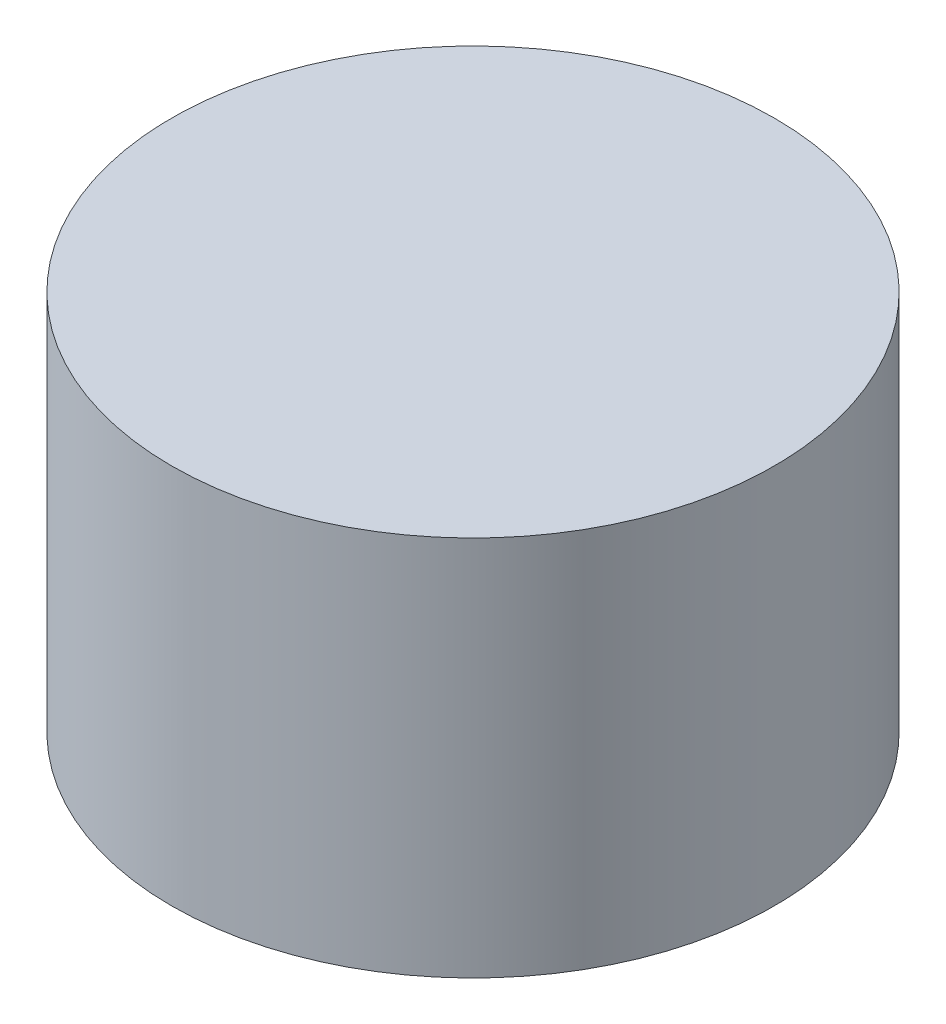
ISO-10303-21;
HEADER;
FILE_DESCRIPTION(('STEP AP214'),'2;1');
FILE_NAME('part.step','',(''),(''),'','','');
FILE_SCHEMA(('AUTOMOTIVE_DESIGN { 1 0 10303 214 1 1 1 1 }'));
ENDSEC;
DATA;
#1=APPLICATION_CONTEXT('core data for automotive mechanical design processes');
#2=APPLICATION_PROTOCOL_DEFINITION('international standard','automotive_design',2000,#1);
#3=PRODUCT_CONTEXT('',#1,'mechanical');
#4=PRODUCT('Part','Part','',(#3));
#5=PRODUCT_RELATED_PRODUCT_CATEGORY('part','',(#4));
#6=PRODUCT_DEFINITION_FORMATION('','',#4);
#7=PRODUCT_DEFINITION_CONTEXT('part definition',#1,'design');
#8=PRODUCT_DEFINITION('design','',#6,#7);
#9=PRODUCT_DEFINITION_SHAPE('','',#8);
#10=(LENGTH_UNIT() NAMED_UNIT(*) SI_UNIT(.MILLI.,.METRE.));
#11=(NAMED_UNIT(*) PLANE_ANGLE_UNIT() SI_UNIT($,.RADIAN.));
#12=(NAMED_UNIT(*) SI_UNIT($,.STERADIAN.) SOLID_ANGLE_UNIT());
#13=UNCERTAINTY_MEASURE_WITH_UNIT(LENGTH_MEASURE(1.E-05),#10,'distance_accuracy_value','');
#14=(GEOMETRIC_REPRESENTATION_CONTEXT(3) GLOBAL_UNCERTAINTY_ASSIGNED_CONTEXT((#13)) GLOBAL_UNIT_ASSIGNED_CONTEXT((#10,
#11,#12)) REPRESENTATION_CONTEXT('',''));
#15=CARTESIAN_POINT('',(0.,0.,0.));
#16=DIRECTION('',(0.,0.,1.));
#17=DIRECTION('',(1.,0.,0.));
#18=AXIS2_PLACEMENT_3D('',#15,#16,#17);
#19=CARTESIAN_POINT('',(0.,141.,0.));
#20=DIRECTION('',(0.,-1.,0.));
#21=DIRECTION('',(0.,0.,-1.));
#22=AXIS2_PLACEMENT_3D('',#19,#20,#21);
#23=CYLINDRICAL_SURFACE('',#22,111.5);
#24=CARTESIAN_POINT('',(0.,141.,0.));
#25=DIRECTION('',(0.,1.,0.));
#26=DIRECTION('',(0.,0.,1.));
#27=AXIS2_PLACEMENT_3D('',#24,#25,#26);
#28=CIRCLE('',#27,111.5);
#29=CARTESIAN_POINT('',(0.,141.,111.5));
#30=VERTEX_POINT('',#29);
#31=EDGE_CURVE('E10',#30,#30,#28,.T.);
#32=ORIENTED_EDGE('',*,*,#31,.F.);
#33=EDGE_LOOP('',(#32));
#34=FACE_BOUND('',#33,.T.);
#35=CARTESIAN_POINT('',(0.,0.,0.));
#36=DIRECTION('',(0.,1.,0.));
#37=DIRECTION('',(0.,0.,1.));
#38=AXIS2_PLACEMENT_3D('',#35,#36,#37);
#39=CIRCLE('',#38,111.5);
#40=CARTESIAN_POINT('',(0.,0.,111.5));
#41=VERTEX_POINT('',#40);
#42=EDGE_CURVE('E40',#41,#41,#39,.T.);
#43=ORIENTED_EDGE('',*,*,#42,.T.);
#44=EDGE_LOOP('',(#43));
#45=FACE_BOUND('',#44,.T.);
#46=ADVANCED_FACE('F37',(#34,#45),#23,.T.);
#47=CARTESIAN_POINT('',(0.,141.,0.));
#48=DIRECTION('',(0.,1.,0.));
#49=DIRECTION('',(0.,0.,1.));
#50=AXIS2_PLACEMENT_3D('',#47,#48,#49);
#51=PLANE('',#50);
#52=ORIENTED_EDGE('',*,*,#31,.T.);
#53=EDGE_LOOP('',(#52));
#54=FACE_BOUND('',#53,.T.);
#55=ADVANCED_FACE('F54',(#54),#51,.T.);
#56=CARTESIAN_POINT('',(0.,0.,0.));
#57=DIRECTION('',(0.,1.,0.));
#58=DIRECTION('',(0.,0.,1.));
#59=AXIS2_PLACEMENT_3D('',#56,#57,#58);
#60=PLANE('',#59);
#61=ORIENTED_EDGE('',*,*,#42,.F.);
#62=EDGE_LOOP('',(#61));
#63=FACE_BOUND('',#62,.T.);
#64=ADVANCED_FACE('F52',(#63),#60,.F.);
#65=CLOSED_SHELL('',(#46,#55,#64));
#66=MANIFOLD_SOLID_BREP('B2',#65);
#67=ADVANCED_BREP_SHAPE_REPRESENTATION('',(#18,#66),#14);
#68=SHAPE_DEFINITION_REPRESENTATION(#9,#67);
ENDSEC;
END-ISO-10303-21;
